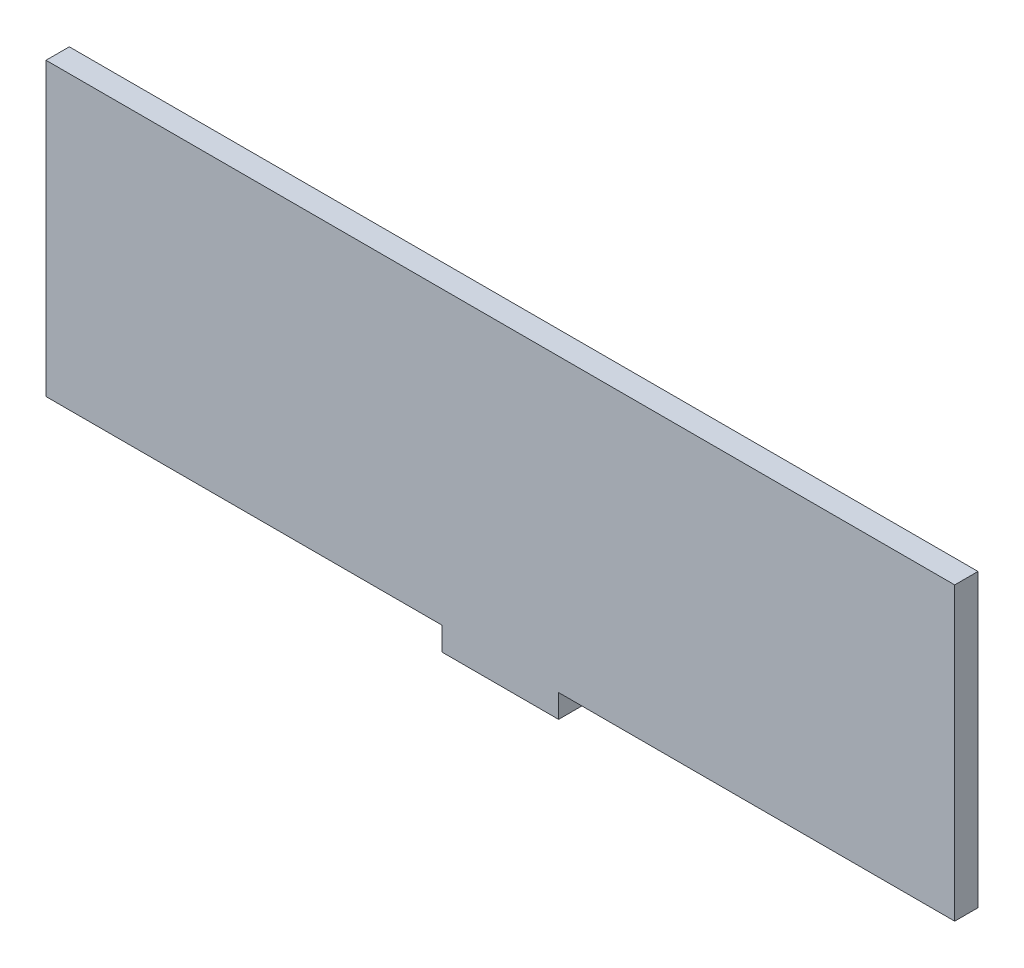
ISO-10303-21;
HEADER;
FILE_DESCRIPTION(('STEP AP214'),'2;1');
FILE_NAME('part.step','',(''),(''),'','','');
FILE_SCHEMA(('AUTOMOTIVE_DESIGN { 1 0 10303 214 1 1 1 1 }'));
ENDSEC;
DATA;
#1=APPLICATION_CONTEXT('core data for automotive mechanical design processes');
#2=APPLICATION_PROTOCOL_DEFINITION('international standard','automotive_design',2000,#1);
#3=PRODUCT_CONTEXT('',#1,'mechanical');
#4=PRODUCT('Part','Part','',(#3));
#5=PRODUCT_RELATED_PRODUCT_CATEGORY('part','',(#4));
#6=PRODUCT_DEFINITION_FORMATION('','',#4);
#7=PRODUCT_DEFINITION_CONTEXT('part definition',#1,'design');
#8=PRODUCT_DEFINITION('design','',#6,#7);
#9=PRODUCT_DEFINITION_SHAPE('','',#8);
#10=(LENGTH_UNIT() NAMED_UNIT(*) SI_UNIT(.MILLI.,.METRE.));
#11=(NAMED_UNIT(*) PLANE_ANGLE_UNIT() SI_UNIT($,.RADIAN.));
#12=(NAMED_UNIT(*) SI_UNIT($,.STERADIAN.) SOLID_ANGLE_UNIT());
#13=UNCERTAINTY_MEASURE_WITH_UNIT(LENGTH_MEASURE(1.E-05),#10,'distance_accuracy_value','');
#14=(GEOMETRIC_REPRESENTATION_CONTEXT(3) GLOBAL_UNCERTAINTY_ASSIGNED_CONTEXT((#13)) GLOBAL_UNIT_ASSIGNED_CONTEXT((#10,
#11,#12)) REPRESENTATION_CONTEXT('',''));
#15=CARTESIAN_POINT('',(0.,0.,0.));
#16=DIRECTION('',(0.,0.,1.));
#17=DIRECTION('',(1.,0.,0.));
#18=AXIS2_PLACEMENT_3D('',#15,#16,#17);
#19=CARTESIAN_POINT('',(-39.,12.5,2.));
#20=DIRECTION('',(0.,-1.,0.));
#21=DIRECTION('',(0.,0.,-1.));
#22=AXIS2_PLACEMENT_3D('',#19,#20,#21);
#23=PLANE('',#22);
#24=DIRECTION('',(-1.,0.,0.));
#25=VECTOR('',#24,1.);
#26=CARTESIAN_POINT('',(-39.,12.5,0.));
#27=LINE('',#26,#25);
#28=CARTESIAN_POINT('',(39.,12.5,0.));
#29=VERTEX_POINT('',#28);
#30=CARTESIAN_POINT('',(-39.,12.5,0.));
#31=VERTEX_POINT('',#30);
#32=EDGE_CURVE('E91',#29,#31,#27,.T.);
#33=ORIENTED_EDGE('',*,*,#32,.T.);
#34=DIRECTION('',(0.,0.,-1.));
#35=VECTOR('',#34,1.);
#36=CARTESIAN_POINT('',(-39.,12.5,2.));
#37=LINE('',#36,#35);
#38=CARTESIAN_POINT('',(-39.,12.5,2.));
#39=VERTEX_POINT('',#38);
#40=EDGE_CURVE('E11',#39,#31,#37,.T.);
#41=ORIENTED_EDGE('',*,*,#40,.F.);
#42=DIRECTION('',(-1.,0.,0.));
#43=VECTOR('',#42,1.);
#44=CARTESIAN_POINT('',(5.,12.5,2.));
#45=LINE('',#44,#43);
#46=CARTESIAN_POINT('',(39.,12.5,2.));
#47=VERTEX_POINT('',#46);
#48=EDGE_CURVE('E97',#47,#39,#45,.T.);
#49=ORIENTED_EDGE('',*,*,#48,.F.);
#50=DIRECTION('',(0.,0.,-1.));
#51=VECTOR('',#50,1.);
#52=CARTESIAN_POINT('',(39.,12.5,2.));
#53=LINE('',#52,#51);
#54=EDGE_CURVE('E131',#47,#29,#53,.T.);
#55=ORIENTED_EDGE('',*,*,#54,.T.);
#56=EDGE_LOOP('',(#33,#41,#49,#55));
#57=FACE_BOUND('',#56,.T.);
#58=ADVANCED_FACE('F39',(#57),#23,.F.);
#59=CARTESIAN_POINT('',(-39.,-12.5,2.));
#60=DIRECTION('',(1.,0.,0.));
#61=DIRECTION('',(0.,0.,-1.));
#62=AXIS2_PLACEMENT_3D('',#59,#60,#61);
#63=PLANE('',#62);
#64=DIRECTION('',(0.,-1.,0.));
#65=VECTOR('',#64,1.);
#66=CARTESIAN_POINT('',(-39.,-12.5,0.));
#67=LINE('',#66,#65);
#68=CARTESIAN_POINT('',(-39.,-12.5,0.));
#69=VERTEX_POINT('',#68);
#70=EDGE_CURVE('E136',#31,#69,#67,.T.);
#71=ORIENTED_EDGE('',*,*,#70,.T.);
#72=DIRECTION('',(0.,0.,-1.));
#73=VECTOR('',#72,1.);
#74=CARTESIAN_POINT('',(-39.,-12.5,2.));
#75=LINE('',#74,#73);
#76=CARTESIAN_POINT('',(-39.,-12.5,2.));
#77=VERTEX_POINT('',#76);
#78=EDGE_CURVE('E47',#77,#69,#75,.T.);
#79=ORIENTED_EDGE('',*,*,#78,.F.);
#80=DIRECTION('',(0.,-1.,0.));
#81=VECTOR('',#80,1.);
#82=CARTESIAN_POINT('',(-39.,-12.5,2.));
#83=LINE('',#82,#81);
#84=EDGE_CURVE('E180',#39,#77,#83,.T.);
#85=ORIENTED_EDGE('',*,*,#84,.F.);
#86=ORIENTED_EDGE('',*,*,#40,.T.);
#87=EDGE_LOOP('',(#71,#79,#85,#86));
#88=FACE_BOUND('',#87,.T.);
#89=ADVANCED_FACE('F182',(#88),#63,.F.);
#90=CARTESIAN_POINT('',(-39.,-12.5,2.));
#91=DIRECTION('',(0.,1.,0.));
#92=DIRECTION('',(0.,0.,1.));
#93=AXIS2_PLACEMENT_3D('',#90,#91,#92);
#94=PLANE('',#93);
#95=DIRECTION('',(1.,0.,0.));
#96=VECTOR('',#95,1.);
#97=CARTESIAN_POINT('',(-39.,-12.5,0.));
#98=LINE('',#97,#96);
#99=CARTESIAN_POINT('',(-5.,-12.5,0.));
#100=VERTEX_POINT('',#99);
#101=EDGE_CURVE('E138',#69,#100,#98,.T.);
#102=ORIENTED_EDGE('',*,*,#101,.T.);
#103=DIRECTION('',(0.,0.,-1.));
#104=VECTOR('',#103,1.);
#105=CARTESIAN_POINT('',(-5.,-12.5,2.));
#106=LINE('',#105,#104);
#107=CARTESIAN_POINT('',(-5.,-12.5,2.));
#108=VERTEX_POINT('',#107);
#109=EDGE_CURVE('E155',#108,#100,#106,.T.);
#110=ORIENTED_EDGE('',*,*,#109,.F.);
#111=DIRECTION('',(1.,0.,0.));
#112=VECTOR('',#111,1.);
#113=CARTESIAN_POINT('',(-39.,-12.5,2.));
#114=LINE('',#113,#112);
#115=EDGE_CURVE('E164',#77,#108,#114,.T.);
#116=ORIENTED_EDGE('',*,*,#115,.F.);
#117=ORIENTED_EDGE('',*,*,#78,.T.);
#118=EDGE_LOOP('',(#102,#110,#116,#117));
#119=FACE_BOUND('',#118,.T.);
#120=ADVANCED_FACE('F162',(#119),#94,.F.);
#121=CARTESIAN_POINT('',(-5.,-14.5,2.));
#122=DIRECTION('',(1.,0.,0.));
#123=DIRECTION('',(0.,0.,-1.));
#124=AXIS2_PLACEMENT_3D('',#121,#122,#123);
#125=PLANE('',#124);
#126=DIRECTION('',(0.,-1.,0.));
#127=VECTOR('',#126,1.);
#128=CARTESIAN_POINT('',(-5.,-14.5,0.));
#129=LINE('',#128,#127);
#130=CARTESIAN_POINT('',(-5.,-14.5,0.));
#131=VERTEX_POINT('',#130);
#132=EDGE_CURVE('E140',#100,#131,#129,.T.);
#133=ORIENTED_EDGE('',*,*,#132,.T.);
#134=DIRECTION('',(0.,0.,-1.));
#135=VECTOR('',#134,1.);
#136=CARTESIAN_POINT('',(-5.,-14.5,2.));
#137=LINE('',#136,#135);
#138=CARTESIAN_POINT('',(-5.,-14.5,2.));
#139=VERTEX_POINT('',#138);
#140=EDGE_CURVE('E152',#139,#131,#137,.T.);
#141=ORIENTED_EDGE('',*,*,#140,.F.);
#142=DIRECTION('',(0.,-1.,0.));
#143=VECTOR('',#142,1.);
#144=CARTESIAN_POINT('',(-5.,-14.5,2.));
#145=LINE('',#144,#143);
#146=EDGE_CURVE('E176',#108,#139,#145,.T.);
#147=ORIENTED_EDGE('',*,*,#146,.F.);
#148=ORIENTED_EDGE('',*,*,#109,.T.);
#149=EDGE_LOOP('',(#133,#141,#147,#148));
#150=FACE_BOUND('',#149,.T.);
#151=ADVANCED_FACE('F172',(#150),#125,.F.);
#152=CARTESIAN_POINT('',(-5.,-14.5,2.));
#153=DIRECTION('',(0.,1.,0.));
#154=DIRECTION('',(-1.,0.,0.));
#155=AXIS2_PLACEMENT_3D('',#152,#153,#154);
#156=PLANE('',#155);
#157=DIRECTION('',(1.,0.,0.));
#158=VECTOR('',#157,1.);
#159=CARTESIAN_POINT('',(-5.,-14.5,0.));
#160=LINE('',#159,#158);
#161=CARTESIAN_POINT('',(5.,-14.5,0.));
#162=VERTEX_POINT('',#161);
#163=EDGE_CURVE('E142',#131,#162,#160,.T.);
#164=ORIENTED_EDGE('',*,*,#163,.T.);
#165=DIRECTION('',(0.,0.,-1.));
#166=VECTOR('',#165,1.);
#167=CARTESIAN_POINT('',(5.,-14.5,2.));
#168=LINE('',#167,#166);
#169=CARTESIAN_POINT('',(5.,-14.5,2.));
#170=VERTEX_POINT('',#169);
#171=EDGE_CURVE('E126',#170,#162,#168,.T.);
#172=ORIENTED_EDGE('',*,*,#171,.F.);
#173=DIRECTION('',(1.,0.,0.));
#174=VECTOR('',#173,1.);
#175=CARTESIAN_POINT('',(-5.,-14.5,2.));
#176=LINE('',#175,#174);
#177=EDGE_CURVE('E117',#139,#170,#176,.T.);
#178=ORIENTED_EDGE('',*,*,#177,.F.);
#179=ORIENTED_EDGE('',*,*,#140,.T.);
#180=EDGE_LOOP('',(#164,#172,#178,#179));
#181=FACE_BOUND('',#180,.T.);
#182=ADVANCED_FACE('F175',(#181),#156,.F.);
#183=CARTESIAN_POINT('',(5.,-14.5,2.));
#184=DIRECTION('',(-1.,0.,0.));
#185=DIRECTION('',(0.,0.,1.));
#186=AXIS2_PLACEMENT_3D('',#183,#184,#185);
#187=PLANE('',#186);
#188=DIRECTION('',(0.,1.,0.));
#189=VECTOR('',#188,1.);
#190=CARTESIAN_POINT('',(5.,-14.5,0.));
#191=LINE('',#190,#189);
#192=CARTESIAN_POINT('',(5.,-12.5,0.));
#193=VERTEX_POINT('',#192);
#194=EDGE_CURVE('E125',#162,#193,#191,.T.);
#195=ORIENTED_EDGE('',*,*,#194,.T.);
#196=DIRECTION('',(0.,0.,-1.));
#197=VECTOR('',#196,1.);
#198=CARTESIAN_POINT('',(5.,-12.5,2.));
#199=LINE('',#198,#197);
#200=CARTESIAN_POINT('',(5.,-12.5,2.));
#201=VERTEX_POINT('',#200);
#202=EDGE_CURVE('E122',#201,#193,#199,.T.);
#203=ORIENTED_EDGE('',*,*,#202,.F.);
#204=DIRECTION('',(0.,1.,0.));
#205=VECTOR('',#204,1.);
#206=CARTESIAN_POINT('',(5.,-14.5,2.));
#207=LINE('',#206,#205);
#208=EDGE_CURVE('E111',#170,#201,#207,.T.);
#209=ORIENTED_EDGE('',*,*,#208,.F.);
#210=ORIENTED_EDGE('',*,*,#171,.T.);
#211=EDGE_LOOP('',(#195,#203,#209,#210));
#212=FACE_BOUND('',#211,.T.);
#213=ADVANCED_FACE('F123',(#212),#187,.F.);
#214=CARTESIAN_POINT('',(5.,-12.5,2.));
#215=DIRECTION('',(0.,1.,0.));
#216=DIRECTION('',(0.,0.,1.));
#217=AXIS2_PLACEMENT_3D('',#214,#215,#216);
#218=PLANE('',#217);
#219=DIRECTION('',(1.,0.,0.));
#220=VECTOR('',#219,1.);
#221=CARTESIAN_POINT('',(5.,-12.5,0.));
#222=LINE('',#221,#220);
#223=CARTESIAN_POINT('',(39.,-12.5,0.));
#224=VERTEX_POINT('',#223);
#225=EDGE_CURVE('E84',#193,#224,#222,.T.);
#226=ORIENTED_EDGE('',*,*,#225,.T.);
#227=DIRECTION('',(0.,0.,-1.));
#228=VECTOR('',#227,1.);
#229=CARTESIAN_POINT('',(39.,-12.5,2.));
#230=LINE('',#229,#228);
#231=CARTESIAN_POINT('',(39.,-12.5,2.));
#232=VERTEX_POINT('',#231);
#233=EDGE_CURVE('E127',#232,#224,#230,.T.);
#234=ORIENTED_EDGE('',*,*,#233,.F.);
#235=DIRECTION('',(1.,0.,0.));
#236=VECTOR('',#235,1.);
#237=CARTESIAN_POINT('',(5.,-12.5,2.));
#238=LINE('',#237,#236);
#239=EDGE_CURVE('E115',#201,#232,#238,.T.);
#240=ORIENTED_EDGE('',*,*,#239,.F.);
#241=ORIENTED_EDGE('',*,*,#202,.T.);
#242=EDGE_LOOP('',(#226,#234,#240,#241));
#243=FACE_BOUND('',#242,.T.);
#244=ADVANCED_FACE('F129',(#243),#218,.F.);
#245=CARTESIAN_POINT('',(39.,-12.5,2.));
#246=DIRECTION('',(-1.,0.,0.));
#247=DIRECTION('',(0.,0.,1.));
#248=AXIS2_PLACEMENT_3D('',#245,#246,#247);
#249=PLANE('',#248);
#250=DIRECTION('',(0.,1.,0.));
#251=VECTOR('',#250,1.);
#252=CARTESIAN_POINT('',(39.,-12.5,0.));
#253=LINE('',#252,#251);
#254=EDGE_CURVE('E146',#224,#29,#253,.T.);
#255=ORIENTED_EDGE('',*,*,#254,.T.);
#256=ORIENTED_EDGE('',*,*,#54,.F.);
#257=DIRECTION('',(0.,1.,0.));
#258=VECTOR('',#257,1.);
#259=CARTESIAN_POINT('',(39.,-12.5,2.));
#260=LINE('',#259,#258);
#261=EDGE_CURVE('E55',#232,#47,#260,.T.);
#262=ORIENTED_EDGE('',*,*,#261,.F.);
#263=ORIENTED_EDGE('',*,*,#233,.T.);
#264=EDGE_LOOP('',(#255,#256,#262,#263));
#265=FACE_BOUND('',#264,.T.);
#266=ADVANCED_FACE('F185',(#265),#249,.F.);
#267=CARTESIAN_POINT('',(0.,0.,2.));
#268=DIRECTION('',(0.,0.,1.));
#269=DIRECTION('',(1.,0.,0.));
#270=AXIS2_PLACEMENT_3D('',#267,#268,#269);
#271=PLANE('',#270);
#272=ORIENTED_EDGE('',*,*,#48,.T.);
#273=ORIENTED_EDGE('',*,*,#84,.T.);
#274=ORIENTED_EDGE('',*,*,#115,.T.);
#275=ORIENTED_EDGE('',*,*,#146,.T.);
#276=ORIENTED_EDGE('',*,*,#177,.T.);
#277=ORIENTED_EDGE('',*,*,#208,.T.);
#278=ORIENTED_EDGE('',*,*,#239,.T.);
#279=ORIENTED_EDGE('',*,*,#261,.T.);
#280=EDGE_LOOP('',(#272,#273,#274,#275,#276,#277,#278,#279));
#281=FACE_BOUND('',#280,.T.);
#282=ADVANCED_FACE('F113',(#281),#271,.T.);
#283=CARTESIAN_POINT('',(0.,0.,0.));
#284=DIRECTION('',(0.,0.,1.));
#285=DIRECTION('',(1.,0.,0.));
#286=AXIS2_PLACEMENT_3D('',#283,#284,#285);
#287=PLANE('',#286);
#288=ORIENTED_EDGE('',*,*,#32,.F.);
#289=ORIENTED_EDGE('',*,*,#254,.F.);
#290=ORIENTED_EDGE('',*,*,#225,.F.);
#291=ORIENTED_EDGE('',*,*,#194,.F.);
#292=ORIENTED_EDGE('',*,*,#163,.F.);
#293=ORIENTED_EDGE('',*,*,#132,.F.);
#294=ORIENTED_EDGE('',*,*,#101,.F.);
#295=ORIENTED_EDGE('',*,*,#70,.F.);
#296=EDGE_LOOP('',(#288,#289,#290,#291,#292,#293,#294,#295));
#297=FACE_BOUND('',#296,.T.);
#298=ADVANCED_FACE('F168',(#297),#287,.F.);
#299=CLOSED_SHELL('',(#58,#89,#120,#151,#182,#213,#244,#266,#282,#298));
#300=MANIFOLD_SOLID_BREP('B2',#299);
#301=ADVANCED_BREP_SHAPE_REPRESENTATION('',(#18,#300),#14);
#302=SHAPE_DEFINITION_REPRESENTATION(#9,#301);
ENDSEC;
END-ISO-10303-21;
